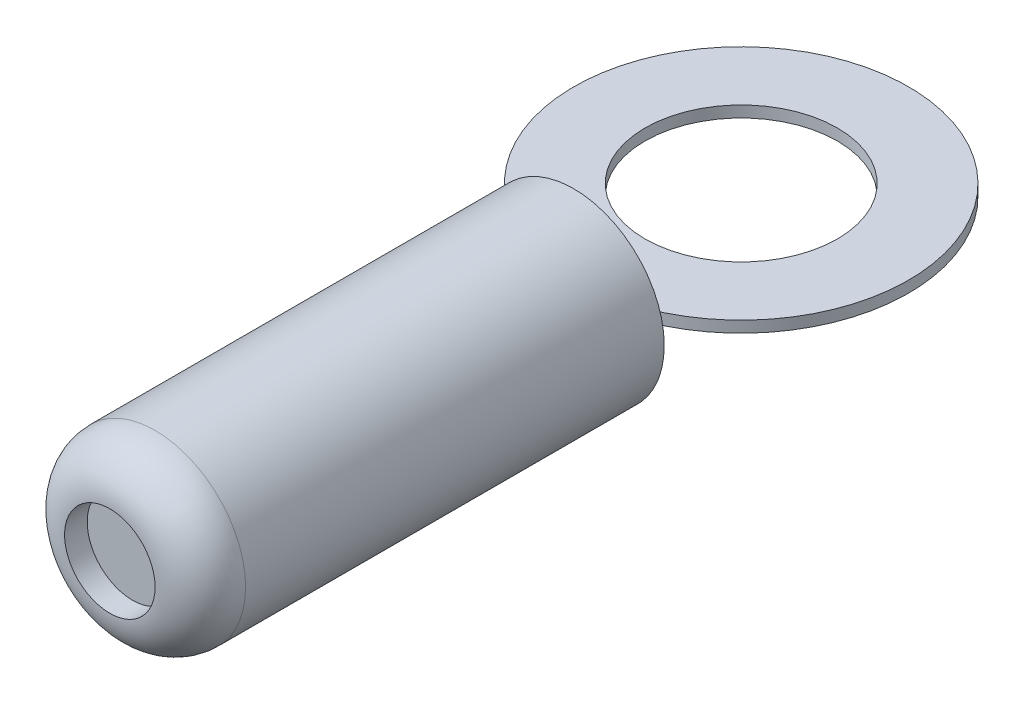
ISO-10303-21;
HEADER;
FILE_DESCRIPTION(('STEP AP214'),'2;1');
FILE_NAME('part.step','',(''),(''),'','','');
FILE_SCHEMA(('AUTOMOTIVE_DESIGN { 1 0 10303 214 1 1 1 1 }'));
ENDSEC;
DATA;
#1=APPLICATION_CONTEXT('core data for automotive mechanical design processes');
#2=APPLICATION_PROTOCOL_DEFINITION('international standard','automotive_design',2000,#1);
#3=PRODUCT_CONTEXT('',#1,'mechanical');
#4=PRODUCT('Part','Part','',(#3));
#5=PRODUCT_RELATED_PRODUCT_CATEGORY('part','',(#4));
#6=PRODUCT_DEFINITION_FORMATION('','',#4);
#7=PRODUCT_DEFINITION_CONTEXT('part definition',#1,'design');
#8=PRODUCT_DEFINITION('design','',#6,#7);
#9=PRODUCT_DEFINITION_SHAPE('','',#8);
#10=(LENGTH_UNIT() NAMED_UNIT(*) SI_UNIT(.MILLI.,.METRE.));
#11=(NAMED_UNIT(*) PLANE_ANGLE_UNIT() SI_UNIT($,.RADIAN.));
#12=(NAMED_UNIT(*) SI_UNIT($,.STERADIAN.) SOLID_ANGLE_UNIT());
#13=UNCERTAINTY_MEASURE_WITH_UNIT(LENGTH_MEASURE(1.E-05),#10,'distance_accuracy_value','');
#14=(GEOMETRIC_REPRESENTATION_CONTEXT(3) GLOBAL_UNCERTAINTY_ASSIGNED_CONTEXT((#13)) GLOBAL_UNIT_ASSIGNED_CONTEXT((#10,
#11,#12)) REPRESENTATION_CONTEXT('',''));
#15=CARTESIAN_POINT('',(0.,0.,0.));
#16=DIRECTION('',(0.,0.,1.));
#17=DIRECTION('',(1.,0.,0.));
#18=AXIS2_PLACEMENT_3D('',#15,#16,#17);
#19=CARTESIAN_POINT('',(0.,0.5,-7.4));
#20=DIRECTION('',(0.,1.,0.));
#21=DIRECTION('',(0.,0.,1.));
#22=AXIS2_PLACEMENT_3D('',#19,#20,#21);
#23=PLANE('',#22);
#24=CARTESIAN_POINT('',(0.,0.5,-7.4));
#25=DIRECTION('',(0.,1.,0.));
#26=DIRECTION('',(0.,0.,1.));
#27=AXIS2_PLACEMENT_3D('',#24,#25,#26);
#28=CIRCLE('',#27,7.4);
#29=CARTESIAN_POINT('',(0.,0.5,0.));
#30=VERTEX_POINT('',#29);
#31=EDGE_CURVE('E11',#30,#30,#28,.T.);
#32=ORIENTED_EDGE('',*,*,#31,.T.);
#33=EDGE_LOOP('',(#32));
#34=FACE_BOUND('',#33,.T.);
#35=CARTESIAN_POINT('',(0.,0.5,-7.4));
#36=DIRECTION('',(0.,1.,0.));
#37=DIRECTION('',(0.,0.,1.));
#38=AXIS2_PLACEMENT_3D('',#35,#36,#37);
#39=CIRCLE('',#38,4.25);
#40=CARTESIAN_POINT('',(0.,0.5,-3.15));
#41=VERTEX_POINT('',#40);
#42=EDGE_CURVE('E49',#41,#41,#39,.T.);
#43=ORIENTED_EDGE('',*,*,#42,.F.);
#44=EDGE_LOOP('',(#43));
#45=FACE_BOUND('',#44,.T.);
#46=ADVANCED_FACE('F38',(#34,#45),#23,.T.);
#47=CARTESIAN_POINT('',(0.,0.,-7.4));
#48=DIRECTION('',(0.,1.,0.));
#49=DIRECTION('',(0.,0.,1.));
#50=AXIS2_PLACEMENT_3D('',#47,#48,#49);
#51=PLANE('',#50);
#52=CARTESIAN_POINT('',(0.,0.,-7.4));
#53=DIRECTION('',(0.,1.,0.));
#54=DIRECTION('',(0.,0.,1.));
#55=AXIS2_PLACEMENT_3D('',#52,#53,#54);
#56=CIRCLE('',#55,7.4);
#57=CARTESIAN_POINT('',(0.,0.,0.));
#58=VERTEX_POINT('',#57);
#59=EDGE_CURVE('E42',#58,#58,#56,.T.);
#60=ORIENTED_EDGE('',*,*,#59,.F.);
#61=EDGE_LOOP('',(#60));
#62=FACE_BOUND('',#61,.T.);
#63=CARTESIAN_POINT('',(0.,0.,-7.4));
#64=DIRECTION('',(0.,1.,0.));
#65=DIRECTION('',(0.,0.,1.));
#66=AXIS2_PLACEMENT_3D('',#63,#64,#65);
#67=CIRCLE('',#66,4.25);
#68=CARTESIAN_POINT('',(0.,0.,-3.15));
#69=VERTEX_POINT('',#68);
#70=EDGE_CURVE('E51',#69,#69,#67,.T.);
#71=ORIENTED_EDGE('',*,*,#70,.T.);
#72=EDGE_LOOP('',(#71));
#73=FACE_BOUND('',#72,.T.);
#74=ADVANCED_FACE('F61',(#62,#73),#51,.F.);
#75=CARTESIAN_POINT('',(0.,0.5,-7.4));
#76=DIRECTION('',(0.,-1.,0.));
#77=DIRECTION('',(0.,0.,-1.));
#78=AXIS2_PLACEMENT_3D('',#75,#76,#77);
#79=CYLINDRICAL_SURFACE('',#78,7.4);
#80=ORIENTED_EDGE('',*,*,#31,.F.);
#81=EDGE_LOOP('',(#80));
#82=FACE_BOUND('',#81,.T.);
#83=ORIENTED_EDGE('',*,*,#59,.T.);
#84=EDGE_LOOP('',(#83));
#85=FACE_BOUND('',#84,.T.);
#86=ADVANCED_FACE('F40',(#82,#85),#79,.T.);
#87=CARTESIAN_POINT('',(0.,0.5,-7.4));
#88=DIRECTION('',(0.,-1.,0.));
#89=DIRECTION('',(0.,0.,-1.));
#90=AXIS2_PLACEMENT_3D('',#87,#88,#89);
#91=CYLINDRICAL_SURFACE('',#90,4.25);
#92=ORIENTED_EDGE('',*,*,#42,.T.);
#93=EDGE_LOOP('',(#92));
#94=FACE_BOUND('',#93,.T.);
#95=ORIENTED_EDGE('',*,*,#70,.F.);
#96=EDGE_LOOP('',(#95));
#97=FACE_BOUND('',#96,.T.);
#98=ADVANCED_FACE('F57',(#94,#97),#91,.F.);
#99=CLOSED_SHELL('',(#46,#74,#86,#98));
#100=MANIFOLD_SOLID_BREP('B2',#99);
#101=CARTESIAN_POINT('',(0.,0.,20.5));
#102=DIRECTION('',(0.,0.,-1.));
#103=DIRECTION('',(-1.,0.,0.));
#104=AXIS2_PLACEMENT_3D('',#101,#102,#103);
#105=CYLINDRICAL_SURFACE('',#104,4.);
#106=CARTESIAN_POINT('',(0.,0.,18.5));
#107=DIRECTION('',(0.,0.,1.));
#108=DIRECTION('',(1.,0.,0.));
#109=AXIS2_PLACEMENT_3D('',#106,#107,#108);
#110=CIRCLE('',#109,4.);
#111=CARTESIAN_POINT('',(4.,0.,18.5));
#112=VERTEX_POINT('',#111);
#113=EDGE_CURVE('E37',#112,#112,#110,.F.);
#114=ORIENTED_EDGE('',*,*,#113,.T.);
#115=EDGE_LOOP('',(#114));
#116=FACE_BOUND('',#115,.T.);
#117=CARTESIAN_POINT('',(0.,0.,0.));
#118=DIRECTION('',(0.,0.,1.));
#119=DIRECTION('',(1.,0.,0.));
#120=AXIS2_PLACEMENT_3D('',#117,#118,#119);
#121=CIRCLE('',#120,4.);
#122=CARTESIAN_POINT('',(4.,0.,0.));
#123=VERTEX_POINT('',#122);
#124=EDGE_CURVE('E106',#123,#123,#121,.T.);
#125=ORIENTED_EDGE('',*,*,#124,.T.);
#126=EDGE_LOOP('',(#125));
#127=FACE_BOUND('',#126,.T.);
#128=ADVANCED_FACE('F99',(#116,#127),#105,.T.);
#129=CARTESIAN_POINT('',(0.,0.,0.));
#130=DIRECTION('',(0.,0.,1.));
#131=DIRECTION('',(1.,0.,0.));
#132=AXIS2_PLACEMENT_3D('',#129,#130,#131);
#133=PLANE('',#132);
#134=ORIENTED_EDGE('',*,*,#124,.F.);
#135=EDGE_LOOP('',(#134));
#136=FACE_BOUND('',#135,.T.);
#137=ADVANCED_FACE('F123',(#136),#133,.F.);
#138=CARTESIAN_POINT('',(0.,0.,18.5));
#139=DIRECTION('',(0.,0.,1.));
#140=DIRECTION('',(1.,0.,0.));
#141=AXIS2_PLACEMENT_3D('',#138,#139,#140);
#142=DEGENERATE_TOROIDAL_SURFACE('',#141,2.,2.,.T.);
#143=ORIENTED_EDGE('',*,*,#113,.F.);
#144=EDGE_LOOP('',(#143));
#145=FACE_BOUND('',#144,.T.);
#146=CARTESIAN_POINT('',(0.,0.,20.5));
#147=DIRECTION('',(0.,0.,1.));
#148=DIRECTION('',(1.,0.,0.));
#149=AXIS2_PLACEMENT_3D('',#146,#147,#148);
#150=CIRCLE('',#149,2.);
#151=CARTESIAN_POINT('',(2.,0.,20.5));
#152=VERTEX_POINT('',#151);
#153=EDGE_CURVE('E114',#152,#152,#150,.T.);
#154=ORIENTED_EDGE('',*,*,#153,.F.);
#155=EDGE_LOOP('',(#154));
#156=FACE_BOUND('',#155,.T.);
#157=ADVANCED_FACE('F101',(#145,#156),#142,.T.);
#158=CARTESIAN_POINT('',(0.,0.,19.5));
#159=DIRECTION('',(0.,0.,1.));
#160=DIRECTION('',(1.,0.,0.));
#161=AXIS2_PLACEMENT_3D('',#158,#159,#160);
#162=CYLINDRICAL_SURFACE('',#161,2.);
#163=CARTESIAN_POINT('',(0.,0.,19.5));
#164=DIRECTION('',(0.,0.,1.));
#165=DIRECTION('',(1.,0.,0.));
#166=AXIS2_PLACEMENT_3D('',#163,#164,#165);
#167=CIRCLE('',#166,2.);
#168=CARTESIAN_POINT('',(2.,0.,19.5));
#169=VERTEX_POINT('',#168);
#170=EDGE_CURVE('E110',#169,#169,#167,.T.);
#171=ORIENTED_EDGE('',*,*,#170,.F.);
#172=EDGE_LOOP('',(#171));
#173=FACE_BOUND('',#172,.T.);
#174=ORIENTED_EDGE('',*,*,#153,.T.);
#175=EDGE_LOOP('',(#174));
#176=FACE_BOUND('',#175,.T.);
#177=ADVANCED_FACE('F120',(#173,#176),#162,.F.);
#178=CARTESIAN_POINT('',(0.,0.,19.5));
#179=DIRECTION('',(0.,0.,1.));
#180=DIRECTION('',(1.,0.,0.));
#181=AXIS2_PLACEMENT_3D('',#178,#179,#180);
#182=PLANE('',#181);
#183=ORIENTED_EDGE('',*,*,#170,.T.);
#184=EDGE_LOOP('',(#183));
#185=FACE_BOUND('',#184,.T.);
#186=ADVANCED_FACE('F129',(#185),#182,.T.);
#187=CLOSED_SHELL('',(#128,#137,#157,#177,#186));
#188=MANIFOLD_SOLID_BREP('B6',#187);
#189=ADVANCED_BREP_SHAPE_REPRESENTATION('',(#18,#100,#188),#14);
#190=SHAPE_DEFINITION_REPRESENTATION(#9,#189);
ENDSEC;
END-ISO-10303-21;
